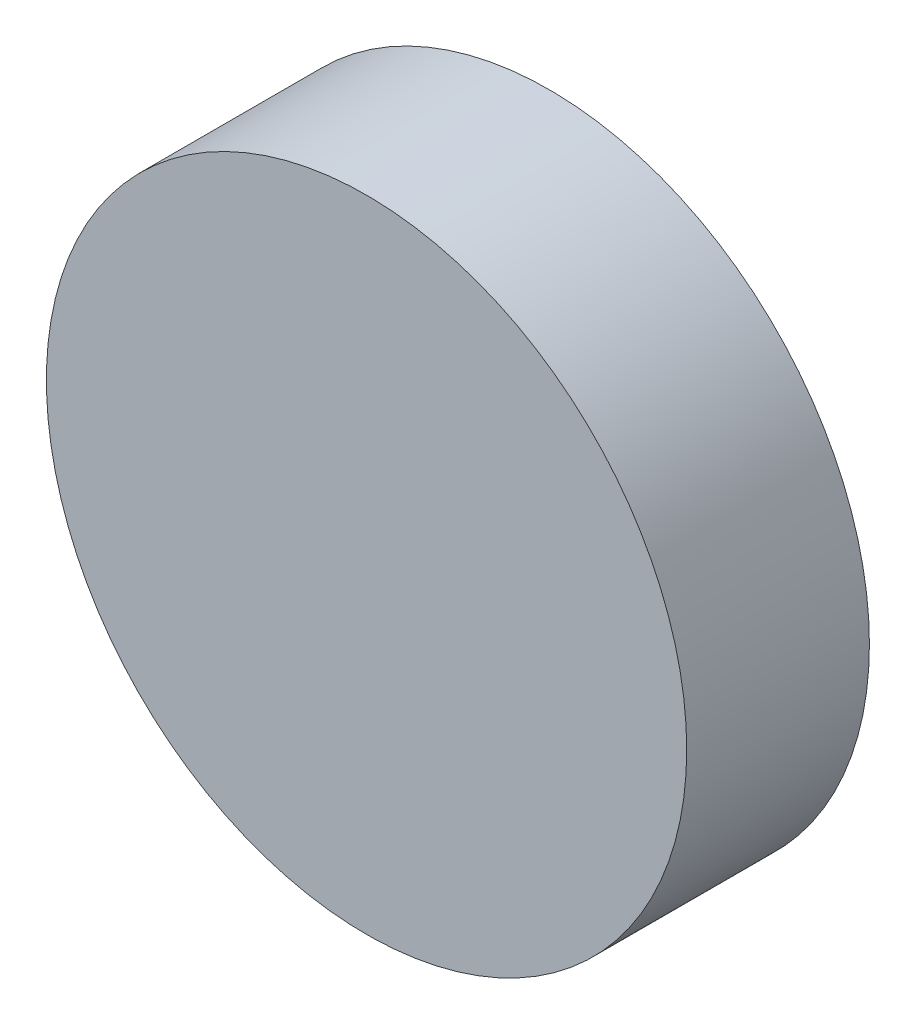
ISO-10303-21;
HEADER;
FILE_DESCRIPTION(('STEP AP214'),'2;1');
FILE_NAME('part.step','',(''),(''),'','','');
FILE_SCHEMA(('AUTOMOTIVE_DESIGN { 1 0 10303 214 1 1 1 1 }'));
ENDSEC;
DATA;
#1=APPLICATION_CONTEXT('core data for automotive mechanical design processes');
#2=APPLICATION_PROTOCOL_DEFINITION('international standard','automotive_design',2000,#1);
#3=PRODUCT_CONTEXT('',#1,'mechanical');
#4=PRODUCT('Part','Part','',(#3));
#5=PRODUCT_RELATED_PRODUCT_CATEGORY('part','',(#4));
#6=PRODUCT_DEFINITION_FORMATION('','',#4);
#7=PRODUCT_DEFINITION_CONTEXT('part definition',#1,'design');
#8=PRODUCT_DEFINITION('design','',#6,#7);
#9=PRODUCT_DEFINITION_SHAPE('','',#8);
#10=(LENGTH_UNIT() NAMED_UNIT(*) SI_UNIT(.MILLI.,.METRE.));
#11=(NAMED_UNIT(*) PLANE_ANGLE_UNIT() SI_UNIT($,.RADIAN.));
#12=(NAMED_UNIT(*) SI_UNIT($,.STERADIAN.) SOLID_ANGLE_UNIT());
#13=UNCERTAINTY_MEASURE_WITH_UNIT(LENGTH_MEASURE(1.E-05),#10,'distance_accuracy_value','');
#14=(GEOMETRIC_REPRESENTATION_CONTEXT(3) GLOBAL_UNCERTAINTY_ASSIGNED_CONTEXT((#13)) GLOBAL_UNIT_ASSIGNED_CONTEXT((#10,
#11,#12)) REPRESENTATION_CONTEXT('',''));
#15=CARTESIAN_POINT('',(0.,0.,0.));
#16=DIRECTION('',(0.,0.,1.));
#17=DIRECTION('',(1.,0.,0.));
#18=AXIS2_PLACEMENT_3D('',#15,#16,#17);
#19=CARTESIAN_POINT('',(0.,0.,0.4));
#20=DIRECTION('',(0.,0.,1.));
#21=DIRECTION('',(1.,0.,0.));
#22=AXIS2_PLACEMENT_3D('',#19,#20,#21);
#23=PLANE('',#22);
#24=CARTESIAN_POINT('',(0.,0.,0.4));
#25=DIRECTION('',(0.,0.,-1.));
#26=DIRECTION('',(-1.,0.,0.));
#27=AXIS2_PLACEMENT_3D('',#24,#25,#26);
#28=CIRCLE('',#27,0.701);
#29=CARTESIAN_POINT('',(0.701,0.,0.4));
#30=VERTEX_POINT('',#29);
#31=EDGE_CURVE('E11',#30,#30,#28,.T.);
#32=ORIENTED_EDGE('',*,*,#31,.F.);
#33=EDGE_LOOP('',(#32));
#34=FACE_BOUND('',#33,.T.);
#35=ADVANCED_FACE('F17',(#34),#23,.T.);
#36=CARTESIAN_POINT('',(0.,0.,0.));
#37=DIRECTION('',(0.,0.,1.));
#38=DIRECTION('',(1.,0.,0.));
#39=AXIS2_PLACEMENT_3D('',#36,#37,#38);
#40=PLANE('',#39);
#41=CARTESIAN_POINT('',(0.,0.,0.));
#42=DIRECTION('',(0.,0.,1.));
#43=DIRECTION('',(-1.,0.,0.));
#44=AXIS2_PLACEMENT_3D('',#41,#42,#43);
#45=CIRCLE('',#44,0.701);
#46=CARTESIAN_POINT('',(0.701,0.,0.));
#47=VERTEX_POINT('',#46);
#48=EDGE_CURVE('E41',#47,#47,#45,.T.);
#49=ORIENTED_EDGE('',*,*,#48,.F.);
#50=EDGE_LOOP('',(#49));
#51=FACE_BOUND('',#50,.T.);
#52=ADVANCED_FACE('F60',(#51),#40,.F.);
#53=CARTESIAN_POINT('',(0.,0.,0.4));
#54=DIRECTION('',(0.,0.,1.));
#55=DIRECTION('',(-1.,0.,0.));
#56=AXIS2_PLACEMENT_3D('',#53,#54,#55);
#57=CYLINDRICAL_SURFACE('',#56,0.701);
#58=ORIENTED_EDGE('',*,*,#48,.T.);
#59=CARTESIAN_POINT('',(0.701,0.,0.));
#60=CARTESIAN_POINT('',(0.701,0.,0.4));
#61=(BOUNDED_CURVE() B_SPLINE_CURVE(1,(#59,#60),.UNSPECIFIED.,.F.,
.F.) B_SPLINE_CURVE_WITH_KNOTS((2,2),(-0.4,0.),
.UNSPECIFIED.) CURVE() GEOMETRIC_REPRESENTATION_ITEM() RATIONAL_B_SPLINE_CURVE((1.,1.)) REPRESENTATION_ITEM(''));
#62=EDGE_CURVE('E25',#47,#30,#61,.T.);
#63=ORIENTED_EDGE('',*,*,#62,.T.);
#64=ORIENTED_EDGE('',*,*,#31,.T.);
#65=ORIENTED_EDGE('',*,*,#62,.F.);
#66=EDGE_LOOP('',(#58,#63,#64,#65));
#67=FACE_BOUND('',#66,.T.);
#68=ADVANCED_FACE('F39',(#67),#57,.T.);
#69=CLOSED_SHELL('',(#35,#52,#68));
#70=MANIFOLD_SOLID_BREP('B1',#69);
#71=ADVANCED_BREP_SHAPE_REPRESENTATION('',(#18,#70),#14);
#72=SHAPE_DEFINITION_REPRESENTATION(#9,#71);
ENDSEC;
END-ISO-10303-21;
